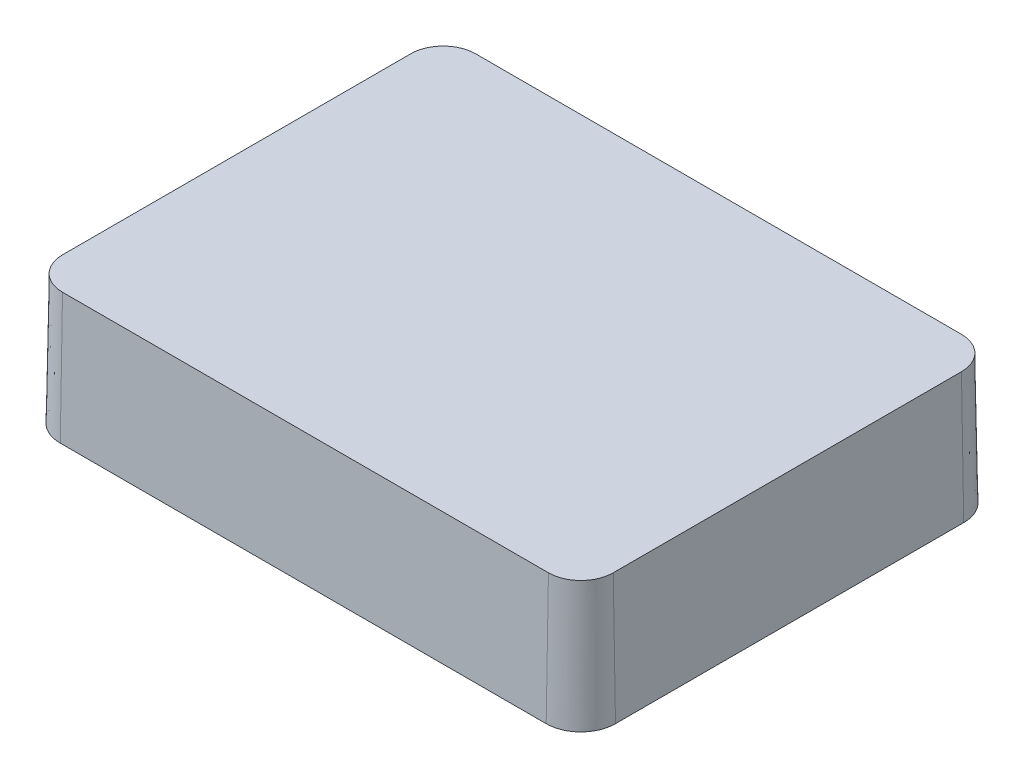
ISO-10303-21;
HEADER;
FILE_DESCRIPTION(('STEP AP214'),'2;1');
FILE_NAME('part.step','',(''),(''),'','','');
FILE_SCHEMA(('AUTOMOTIVE_DESIGN { 1 0 10303 214 1 1 1 1 }'));
ENDSEC;
DATA;
#1=APPLICATION_CONTEXT('core data for automotive mechanical design processes');
#2=APPLICATION_PROTOCOL_DEFINITION('international standard','automotive_design',2000,#1);
#3=PRODUCT_CONTEXT('',#1,'mechanical');
#4=PRODUCT('Part','Part','',(#3));
#5=PRODUCT_RELATED_PRODUCT_CATEGORY('part','',(#4));
#6=PRODUCT_DEFINITION_FORMATION('','',#4);
#7=PRODUCT_DEFINITION_CONTEXT('part definition',#1,'design');
#8=PRODUCT_DEFINITION('design','',#6,#7);
#9=PRODUCT_DEFINITION_SHAPE('','',#8);
#10=(LENGTH_UNIT() NAMED_UNIT(*) SI_UNIT(.MILLI.,.METRE.));
#11=(NAMED_UNIT(*) PLANE_ANGLE_UNIT() SI_UNIT($,.RADIAN.));
#12=(NAMED_UNIT(*) SI_UNIT($,.STERADIAN.) SOLID_ANGLE_UNIT());
#13=UNCERTAINTY_MEASURE_WITH_UNIT(LENGTH_MEASURE(1.E-05),#10,'distance_accuracy_value','');
#14=(GEOMETRIC_REPRESENTATION_CONTEXT(3) GLOBAL_UNCERTAINTY_ASSIGNED_CONTEXT((#13)) GLOBAL_UNIT_ASSIGNED_CONTEXT((#10,
#11,#12)) REPRESENTATION_CONTEXT('',''));
#15=CARTESIAN_POINT('',(0.,0.,0.));
#16=DIRECTION('',(0.,0.,1.));
#17=DIRECTION('',(1.,0.,0.));
#18=AXIS2_PLACEMENT_3D('',#15,#16,#17);
#19=CARTESIAN_POINT('',(-7.5,-0.5,-5.375));
#20=DIRECTION('',(0.,-1.,0.));
#21=DIRECTION('',(0.,0.,-1.));
#22=AXIS2_PLACEMENT_3D('',#19,#20,#21);
#23=PLANE('',#22);
#24=DIRECTION('',(0.,0.,1.));
#25=VECTOR('',#24,1.);
#26=CARTESIAN_POINT('',(-0.599999999999999,-0.5,2.93078797989721));
#27=LINE('',#26,#25);
#28=CARTESIAN_POINT('',(-0.599999999999999,-0.5,0.6));
#29=VERTEX_POINT('',#28);
#30=CARTESIAN_POINT('',(-0.599999999999999,-0.5,2.93078797989721));
#31=VERTEX_POINT('',#30);
#32=EDGE_CURVE('E602',#29,#31,#27,.T.);
#33=ORIENTED_EDGE('',*,*,#32,.F.);
#34=DIRECTION('',(1.,0.,0.));
#35=VECTOR('',#34,1.);
#36=CARTESIAN_POINT('',(-2.93078797989721,-0.5,0.6));
#37=LINE('',#36,#35);
#38=CARTESIAN_POINT('',(-2.93078797989721,-0.5,0.6));
#39=VERTEX_POINT('',#38);
#40=EDGE_CURVE('E328',#39,#29,#37,.T.);
#41=ORIENTED_EDGE('',*,*,#40,.F.);
#42=CARTESIAN_POINT('',(0.,-0.5,0.));
#43=DIRECTION('',(0.,-1.,0.));
#44=DIRECTION('',(0.,0.,-1.));
#45=AXIS2_PLACEMENT_3D('',#42,#43,#44);
#46=CIRCLE('',#45,2.99157453243438);
#47=EDGE_CURVE('E599',#31,#39,#46,.T.);
#48=ORIENTED_EDGE('',*,*,#47,.F.);
#49=EDGE_LOOP('',(#33,#41,#48));
#50=FACE_BOUND('',#49,.T.);
#51=CARTESIAN_POINT('',(-7.5,-0.5,-5.375));
#52=DIRECTION('',(0.,-1.,0.));
#53=DIRECTION('',(0.,0.,-1.));
#54=AXIS2_PLACEMENT_3D('',#51,#52,#53);
#55=CIRCLE('',#54,0.508651368442155);
#56=CARTESIAN_POINT('',(-7.5,-0.5,-5.88365136844215));
#57=VERTEX_POINT('',#56);
#58=CARTESIAN_POINT('',(-8.00865136844216,-0.5,-5.375));
#59=VERTEX_POINT('',#58);
#60=EDGE_CURVE('E565',#57,#59,#55,.F.);
#61=ORIENTED_EDGE('',*,*,#60,.F.);
#62=DIRECTION('',(-1.,0.,0.));
#63=VECTOR('',#62,1.);
#64=CARTESIAN_POINT('',(-7.5,-0.5,-5.88365136844215));
#65=LINE('',#64,#63);
#66=CARTESIAN_POINT('',(7.5,-0.5,-5.88365136844215));
#67=VERTEX_POINT('',#66);
#68=EDGE_CURVE('E560',#67,#57,#65,.T.);
#69=ORIENTED_EDGE('',*,*,#68,.F.);
#70=CARTESIAN_POINT('',(7.5,-0.5,-5.375));
#71=DIRECTION('',(0.,-1.,0.));
#72=DIRECTION('',(0.,0.,-1.));
#73=AXIS2_PLACEMENT_3D('',#70,#71,#72);
#74=CIRCLE('',#73,0.508651368442155);
#75=CARTESIAN_POINT('',(8.00865136844215,-0.5,-5.37499999999999));
#76=VERTEX_POINT('',#75);
#77=EDGE_CURVE('E586',#76,#67,#74,.F.);
#78=ORIENTED_EDGE('',*,*,#77,.F.);
#79=DIRECTION('',(0.,0.,-1.));
#80=VECTOR('',#79,1.);
#81=CARTESIAN_POINT('',(8.00865136844215,-0.5,5.37499999999999));
#82=LINE('',#81,#80);
#83=CARTESIAN_POINT('',(8.00865136844215,-0.5,5.375));
#84=VERTEX_POINT('',#83);
#85=EDGE_CURVE('E581',#84,#76,#82,.T.);
#86=ORIENTED_EDGE('',*,*,#85,.F.);
#87=CARTESIAN_POINT('',(7.5,-0.5,5.375));
#88=DIRECTION('',(0.,-1.,0.));
#89=DIRECTION('',(0.,0.,-1.));
#90=AXIS2_PLACEMENT_3D('',#87,#88,#89);
#91=CIRCLE('',#90,0.508651368442155);
#92=CARTESIAN_POINT('',(7.49999999999999,-0.5,5.88365136844215));
#93=VERTEX_POINT('',#92);
#94=EDGE_CURVE('E576',#93,#84,#91,.F.);
#95=ORIENTED_EDGE('',*,*,#94,.F.);
#96=DIRECTION('',(1.,0.,0.));
#97=VECTOR('',#96,1.);
#98=CARTESIAN_POINT('',(-7.5,-0.5,5.88365136844215));
#99=LINE('',#98,#97);
#100=CARTESIAN_POINT('',(-7.5,-0.5,5.88365136844215));
#101=VERTEX_POINT('',#100);
#102=EDGE_CURVE('E571',#101,#93,#99,.T.);
#103=ORIENTED_EDGE('',*,*,#102,.F.);
#104=CARTESIAN_POINT('',(-7.5,-0.5,5.375));
#105=DIRECTION('',(0.,-1.,0.));
#106=DIRECTION('',(0.,0.,-1.));
#107=AXIS2_PLACEMENT_3D('',#104,#105,#106);
#108=CIRCLE('',#107,0.508651368442155);
#109=CARTESIAN_POINT('',(-8.00865136844216,-0.5,5.37499999999999));
#110=VERTEX_POINT('',#109);
#111=EDGE_CURVE('E564',#110,#101,#108,.F.);
#112=ORIENTED_EDGE('',*,*,#111,.F.);
#113=DIRECTION('',(0.,0.,1.));
#114=VECTOR('',#113,1.);
#115=CARTESIAN_POINT('',(-8.00865136844216,-0.5,5.37499999999999));
#116=LINE('',#115,#114);
#117=EDGE_CURVE('E561',#59,#110,#116,.T.);
#118=ORIENTED_EDGE('',*,*,#117,.F.);
#119=EDGE_LOOP('',(#61,#69,#78,#86,#95,#103,#112,#118));
#120=FACE_BOUND('',#119,.T.);
#121=DIRECTION('',(0.,0.,1.));
#122=VECTOR('',#121,1.);
#123=CARTESIAN_POINT('',(-0.599999999999999,-0.5,-0.6));
#124=LINE('',#123,#122);
#125=CARTESIAN_POINT('',(-0.599999999999999,-0.5,-2.93078797989721));
#126=VERTEX_POINT('',#125);
#127=CARTESIAN_POINT('',(-0.599999999999999,-0.5,-0.6));
#128=VERTEX_POINT('',#127);
#129=EDGE_CURVE('E617',#126,#128,#124,.T.);
#130=ORIENTED_EDGE('',*,*,#129,.F.);
#131=CARTESIAN_POINT('',(0.,-0.5,0.));
#132=DIRECTION('',(0.,-1.,0.));
#133=DIRECTION('',(0.,0.,-1.));
#134=AXIS2_PLACEMENT_3D('',#131,#132,#133);
#135=CIRCLE('',#134,2.99157453243438);
#136=CARTESIAN_POINT('',(-2.93078797989721,-0.5,-0.6));
#137=VERTEX_POINT('',#136);
#138=EDGE_CURVE('E292',#137,#126,#135,.T.);
#139=ORIENTED_EDGE('',*,*,#138,.F.);
#140=DIRECTION('',(-1.,0.,0.));
#141=VECTOR('',#140,1.);
#142=CARTESIAN_POINT('',(-2.93078797989721,-0.5,-0.6));
#143=LINE('',#142,#141);
#144=EDGE_CURVE('E330',#128,#137,#143,.T.);
#145=ORIENTED_EDGE('',*,*,#144,.F.);
#146=EDGE_LOOP('',(#130,#139,#145));
#147=FACE_BOUND('',#146,.T.);
#148=DIRECTION('',(0.,0.,-1.));
#149=VECTOR('',#148,1.);
#150=CARTESIAN_POINT('',(0.599999999999999,-0.5,2.93078797989721));
#151=LINE('',#150,#149);
#152=CARTESIAN_POINT('',(0.599999999999999,-0.5,2.93078797989721));
#153=VERTEX_POINT('',#152);
#154=CARTESIAN_POINT('',(0.599999999999999,-0.5,0.6));
#155=VERTEX_POINT('',#154);
#156=EDGE_CURVE('E632',#153,#155,#151,.T.);
#157=ORIENTED_EDGE('',*,*,#156,.F.);
#158=CARTESIAN_POINT('',(0.,-0.5,0.));
#159=DIRECTION('',(0.,-1.,0.));
#160=DIRECTION('',(0.,0.,-1.));
#161=AXIS2_PLACEMENT_3D('',#158,#159,#160);
#162=CIRCLE('',#161,2.99157453243438);
#163=CARTESIAN_POINT('',(2.93078797989721,-0.5,0.6));
#164=VERTEX_POINT('',#163);
#165=EDGE_CURVE('E234',#164,#153,#162,.T.);
#166=ORIENTED_EDGE('',*,*,#165,.F.);
#167=DIRECTION('',(1.,0.,0.));
#168=VECTOR('',#167,1.);
#169=CARTESIAN_POINT('',(0.599999999999999,-0.5,0.6));
#170=LINE('',#169,#168);
#171=EDGE_CURVE('E293',#155,#164,#170,.T.);
#172=ORIENTED_EDGE('',*,*,#171,.F.);
#173=EDGE_LOOP('',(#157,#166,#172));
#174=FACE_BOUND('',#173,.T.);
#175=DIRECTION('',(-1.,0.,0.));
#176=VECTOR('',#175,1.);
#177=CARTESIAN_POINT('',(0.599999999999999,-0.5,-0.6));
#178=LINE('',#177,#176);
#179=CARTESIAN_POINT('',(2.93078797989721,-0.5,-0.6));
#180=VERTEX_POINT('',#179);
#181=CARTESIAN_POINT('',(0.599999999999999,-0.5,-0.6));
#182=VERTEX_POINT('',#181);
#183=EDGE_CURVE('E228',#180,#182,#178,.T.);
#184=ORIENTED_EDGE('',*,*,#183,.F.);
#185=CARTESIAN_POINT('',(0.,-0.5,0.));
#186=DIRECTION('',(0.,-1.,0.));
#187=DIRECTION('',(0.,0.,-1.));
#188=AXIS2_PLACEMENT_3D('',#185,#186,#187);
#189=CIRCLE('',#188,2.99157453243438);
#190=CARTESIAN_POINT('',(0.599999999999999,-0.5,-2.93078797989721));
#191=VERTEX_POINT('',#190);
#192=EDGE_CURVE('E238',#191,#180,#189,.T.);
#193=ORIENTED_EDGE('',*,*,#192,.F.);
#194=DIRECTION('',(0.,0.,-1.));
#195=VECTOR('',#194,1.);
#196=CARTESIAN_POINT('',(0.599999999999999,-0.5,-0.6));
#197=LINE('',#196,#195);
#198=EDGE_CURVE('E244',#182,#191,#197,.T.);
#199=ORIENTED_EDGE('',*,*,#198,.F.);
#200=EDGE_LOOP('',(#184,#193,#199));
#201=FACE_BOUND('',#200,.T.);
#202=ADVANCED_FACE('F38',(#50,#120,#147,#174,#201),#23,.T.);
#203=CARTESIAN_POINT('',(-7.5,-4.,-5.375));
#204=DIRECTION('',(0.,-1.,0.));
#205=DIRECTION('',(0.,0.,-1.));
#206=AXIS2_PLACEMENT_3D('',#203,#204,#205);
#207=PLANE('',#206);
#208=CARTESIAN_POINT('',(-7.5,-4.,-5.375));
#209=DIRECTION('',(0.,-1.,0.));
#210=DIRECTION('',(0.,0.,-1.));
#211=AXIS2_PLACEMENT_3D('',#208,#209,#210);
#212=CIRCLE('',#211,1.06982025971287);
#213=CARTESIAN_POINT('',(-7.5,-4.,-6.44482025971287));
#214=VERTEX_POINT('',#213);
#215=CARTESIAN_POINT('',(-8.56982025971287,-4.,-5.37499999999999));
#216=VERTEX_POINT('',#215);
#217=EDGE_CURVE('E479',#214,#216,#212,.F.);
#218=ORIENTED_EDGE('',*,*,#217,.F.);
#219=DIRECTION('',(-1.,0.,0.));
#220=VECTOR('',#219,1.);
#221=CARTESIAN_POINT('',(-7.5,-4.,-6.44482025971287));
#222=LINE('',#221,#220);
#223=CARTESIAN_POINT('',(7.49999999999999,-4.,-6.44482025971287));
#224=VERTEX_POINT('',#223);
#225=EDGE_CURVE('E483',#224,#214,#222,.T.);
#226=ORIENTED_EDGE('',*,*,#225,.F.);
#227=CARTESIAN_POINT('',(7.5,-4.,-5.375));
#228=DIRECTION('',(0.,-1.,0.));
#229=DIRECTION('',(0.,0.,-1.));
#230=AXIS2_PLACEMENT_3D('',#227,#228,#229);
#231=CIRCLE('',#230,1.06982025971287);
#232=CARTESIAN_POINT('',(8.56982025971287,-4.,-5.37499999999999));
#233=VERTEX_POINT('',#232);
#234=EDGE_CURVE('E487',#233,#224,#231,.F.);
#235=ORIENTED_EDGE('',*,*,#234,.F.);
#236=DIRECTION('',(0.,0.,-1.));
#237=VECTOR('',#236,1.);
#238=CARTESIAN_POINT('',(8.56982025971287,-4.,5.37499999999999));
#239=LINE('',#238,#237);
#240=CARTESIAN_POINT('',(8.56982025971287,-4.,5.37499999999999));
#241=VERTEX_POINT('',#240);
#242=EDGE_CURVE('E489',#241,#233,#239,.T.);
#243=ORIENTED_EDGE('',*,*,#242,.F.);
#244=CARTESIAN_POINT('',(7.5,-4.,5.375));
#245=DIRECTION('',(0.,-1.,0.));
#246=DIRECTION('',(0.,0.,-1.));
#247=AXIS2_PLACEMENT_3D('',#244,#245,#246);
#248=CIRCLE('',#247,1.06982025971287);
#249=CARTESIAN_POINT('',(7.49999999999999,-4.,6.44482025971287));
#250=VERTEX_POINT('',#249);
#251=EDGE_CURVE('E492',#250,#241,#248,.F.);
#252=ORIENTED_EDGE('',*,*,#251,.F.);
#253=DIRECTION('',(1.,0.,0.));
#254=VECTOR('',#253,1.);
#255=CARTESIAN_POINT('',(-7.5,-4.,6.44482025971287));
#256=LINE('',#255,#254);
#257=CARTESIAN_POINT('',(-7.49999999999999,-4.,6.44482025971287));
#258=VERTEX_POINT('',#257);
#259=EDGE_CURVE('E495',#258,#250,#256,.T.);
#260=ORIENTED_EDGE('',*,*,#259,.F.);
#261=CARTESIAN_POINT('',(-7.5,-4.,5.375));
#262=DIRECTION('',(0.,-1.,0.));
#263=DIRECTION('',(0.,0.,-1.));
#264=AXIS2_PLACEMENT_3D('',#261,#262,#263);
#265=CIRCLE('',#264,1.06982025971287);
#266=CARTESIAN_POINT('',(-8.56982025971287,-4.,5.37499999999999));
#267=VERTEX_POINT('',#266);
#268=EDGE_CURVE('E498',#267,#258,#265,.F.);
#269=ORIENTED_EDGE('',*,*,#268,.F.);
#270=DIRECTION('',(0.,0.,1.));
#271=VECTOR('',#270,1.);
#272=CARTESIAN_POINT('',(-8.56982025971287,-4.,5.37499999999999));
#273=LINE('',#272,#271);
#274=EDGE_CURVE('E482',#216,#267,#273,.T.);
#275=ORIENTED_EDGE('',*,*,#274,.F.);
#276=EDGE_LOOP('',(#218,#226,#235,#243,#252,#260,#269,#275));
#277=FACE_BOUND('',#276,.T.);
#278=DIRECTION('',(-1.,0.,0.));
#279=VECTOR('',#278,1.);
#280=CARTESIAN_POINT('',(-7.5,-4.,-5.94474409569092));
#281=LINE('',#280,#279);
#282=CARTESIAN_POINT('',(7.49999999999999,-4.,-5.94474409569092));
#283=VERTEX_POINT('',#282);
#284=CARTESIAN_POINT('',(-7.5,-4.,-5.94474409569092));
#285=VERTEX_POINT('',#284);
#286=EDGE_CURVE('E554',#283,#285,#281,.T.);
#287=ORIENTED_EDGE('',*,*,#286,.T.);
#288=CARTESIAN_POINT('',(-7.5,-4.,-5.375));
#289=DIRECTION('',(0.,-1.,0.));
#290=DIRECTION('',(0.,0.,-1.));
#291=AXIS2_PLACEMENT_3D('',#288,#289,#290);
#292=CIRCLE('',#291,0.569744095690917);
#293=CARTESIAN_POINT('',(-8.06974409569092,-4.,-5.375));
#294=VERTEX_POINT('',#293);
#295=EDGE_CURVE('E539',#285,#294,#292,.F.);
#296=ORIENTED_EDGE('',*,*,#295,.T.);
#297=DIRECTION('',(0.,0.,1.));
#298=VECTOR('',#297,1.);
#299=CARTESIAN_POINT('',(-8.06974409569092,-4.,5.37499999999999));
#300=LINE('',#299,#298);
#301=CARTESIAN_POINT('',(-8.06974409569092,-4.,5.37499999999999));
#302=VERTEX_POINT('',#301);
#303=EDGE_CURVE('E534',#294,#302,#300,.T.);
#304=ORIENTED_EDGE('',*,*,#303,.T.);
#305=CARTESIAN_POINT('',(-7.5,-4.,5.375));
#306=DIRECTION('',(0.,-1.,0.));
#307=DIRECTION('',(0.,0.,-1.));
#308=AXIS2_PLACEMENT_3D('',#305,#306,#307);
#309=CIRCLE('',#308,0.569744095690917);
#310=CARTESIAN_POINT('',(-7.5,-4.,5.94474409569092));
#311=VERTEX_POINT('',#310);
#312=EDGE_CURVE('E538',#302,#311,#309,.F.);
#313=ORIENTED_EDGE('',*,*,#312,.T.);
#314=DIRECTION('',(1.,0.,0.));
#315=VECTOR('',#314,1.);
#316=CARTESIAN_POINT('',(-7.5,-4.,5.94474409569092));
#317=LINE('',#316,#315);
#318=CARTESIAN_POINT('',(7.49999999999999,-4.,5.94474409569092));
#319=VERTEX_POINT('',#318);
#320=EDGE_CURVE('E542',#311,#319,#317,.T.);
#321=ORIENTED_EDGE('',*,*,#320,.T.);
#322=CARTESIAN_POINT('',(7.5,-4.,5.375));
#323=DIRECTION('',(0.,-1.,0.));
#324=DIRECTION('',(0.,0.,-1.));
#325=AXIS2_PLACEMENT_3D('',#322,#323,#324);
#326=CIRCLE('',#325,0.569744095690917);
#327=CARTESIAN_POINT('',(8.06974409569091,-4.,5.375));
#328=VERTEX_POINT('',#327);
#329=EDGE_CURVE('E545',#319,#328,#326,.F.);
#330=ORIENTED_EDGE('',*,*,#329,.T.);
#331=DIRECTION('',(0.,0.,-1.));
#332=VECTOR('',#331,1.);
#333=CARTESIAN_POINT('',(8.06974409569091,-4.,5.37499999999999));
#334=LINE('',#333,#332);
#335=CARTESIAN_POINT('',(8.06974409569091,-4.,-5.37499999999999));
#336=VERTEX_POINT('',#335);
#337=EDGE_CURVE('E548',#328,#336,#334,.T.);
#338=ORIENTED_EDGE('',*,*,#337,.T.);
#339=CARTESIAN_POINT('',(7.5,-4.,-5.375));
#340=DIRECTION('',(0.,-1.,0.));
#341=DIRECTION('',(0.,0.,-1.));
#342=AXIS2_PLACEMENT_3D('',#339,#340,#341);
#343=CIRCLE('',#342,0.569744095690917);
#344=EDGE_CURVE('E551',#336,#283,#343,.F.);
#345=ORIENTED_EDGE('',*,*,#344,.T.);
#346=EDGE_LOOP('',(#287,#296,#304,#313,#321,#330,#338,#345));
#347=FACE_BOUND('',#346,.T.);
#348=ADVANCED_FACE('F417',(#277,#347),#207,.T.);
#349=CARTESIAN_POINT('',(-7.5,0.,-5.375));
#350=DIRECTION('',(0.,-1.,0.));
#351=DIRECTION('',(0.,0.,-1.));
#352=AXIS2_PLACEMENT_3D('',#349,#350,#351);
#353=CONICAL_SURFACE('',#352,1.,0.0174532925199433);
#354=CARTESIAN_POINT('',(-7.5,0.,-5.375));
#355=DIRECTION('',(0.,1.,0.));
#356=DIRECTION('',(0.,0.,-1.));
#357=AXIS2_PLACEMENT_3D('',#354,#355,#356);
#358=CIRCLE('',#357,1.);
#359=CARTESIAN_POINT('',(-7.5,0.,-6.375));
#360=VERTEX_POINT('',#359);
#361=CARTESIAN_POINT('',(-8.5,0.,-5.37499999999999));
#362=VERTEX_POINT('',#361);
#363=EDGE_CURVE('E527',#360,#362,#358,.T.);
#364=ORIENTED_EDGE('',*,*,#363,.F.);
#365=DIRECTION('',(0.,-0.999847695156391,-0.0174524064372835));
#366=VECTOR('',#365,1.);
#367=CARTESIAN_POINT('',(-7.5,0.,-6.375));
#368=LINE('',#367,#366);
#369=EDGE_CURVE('E11',#214,#360,#368,.F.);
#370=ORIENTED_EDGE('',*,*,#369,.F.);
#371=ORIENTED_EDGE('',*,*,#217,.T.);
#372=DIRECTION('',(-0.0174524064372835,-0.999847695156391,0.));
#373=VECTOR('',#372,1.);
#374=CARTESIAN_POINT('',(-8.5,0.,-5.37499999999999));
#375=LINE('',#374,#373);
#376=EDGE_CURVE('E486',#216,#362,#375,.F.);
#377=ORIENTED_EDGE('',*,*,#376,.T.);
#378=EDGE_LOOP('',(#364,#370,#371,#377));
#379=FACE_BOUND('',#378,.T.);
#380=ADVANCED_FACE('F421',(#379),#353,.T.);
#381=CARTESIAN_POINT('',(-7.5,0.,-6.375));
#382=DIRECTION('',(0.,0.0174524064372835,-0.999847695156391));
#383=DIRECTION('',(0.,0.999847695156391,0.0174524064372835));
#384=AXIS2_PLACEMENT_3D('',#381,#382,#383);
#385=PLANE('',#384);
#386=DIRECTION('',(-1.,0.,0.));
#387=VECTOR('',#386,1.);
#388=CARTESIAN_POINT('',(-7.5,0.,-6.375));
#389=LINE('',#388,#387);
#390=CARTESIAN_POINT('',(7.49999999999999,0.,-6.375));
#391=VERTEX_POINT('',#390);
#392=EDGE_CURVE('E464',#391,#360,#389,.T.);
#393=ORIENTED_EDGE('',*,*,#392,.F.);
#394=DIRECTION('',(0.,-0.999847695156391,-0.0174524064372835));
#395=VECTOR('',#394,1.);
#396=CARTESIAN_POINT('',(7.49999999999999,0.,-6.375));
#397=LINE('',#396,#395);
#398=EDGE_CURVE('E42',#224,#391,#397,.F.);
#399=ORIENTED_EDGE('',*,*,#398,.F.);
#400=ORIENTED_EDGE('',*,*,#225,.T.);
#401=ORIENTED_EDGE('',*,*,#369,.T.);
#402=EDGE_LOOP('',(#393,#399,#400,#401));
#403=FACE_BOUND('',#402,.T.);
#404=ADVANCED_FACE('F40',(#403),#385,.T.);
#405=CARTESIAN_POINT('',(7.5,0.,-5.375));
#406=DIRECTION('',(0.,-1.,0.));
#407=DIRECTION('',(0.,0.,1.));
#408=AXIS2_PLACEMENT_3D('',#405,#406,#407);
#409=CONICAL_SURFACE('',#408,1.,0.0174532925199433);
#410=CARTESIAN_POINT('',(7.5,0.,-5.375));
#411=DIRECTION('',(0.,1.,0.));
#412=DIRECTION('',(0.,0.,1.));
#413=AXIS2_PLACEMENT_3D('',#410,#411,#412);
#414=CIRCLE('',#413,1.);
#415=CARTESIAN_POINT('',(8.5,0.,-5.37499999999999));
#416=VERTEX_POINT('',#415);
#417=EDGE_CURVE('E457',#416,#391,#414,.T.);
#418=ORIENTED_EDGE('',*,*,#417,.F.);
#419=DIRECTION('',(0.0174524064372835,-0.999847695156391,0.));
#420=VECTOR('',#419,1.);
#421=CARTESIAN_POINT('',(8.5,0.,-5.37499999999999));
#422=LINE('',#421,#420);
#423=EDGE_CURVE('E460',#233,#416,#422,.F.);
#424=ORIENTED_EDGE('',*,*,#423,.F.);
#425=ORIENTED_EDGE('',*,*,#234,.T.);
#426=ORIENTED_EDGE('',*,*,#398,.T.);
#427=EDGE_LOOP('',(#418,#424,#425,#426));
#428=FACE_BOUND('',#427,.T.);
#429=ADVANCED_FACE('F447',(#428),#409,.T.);
#430=CARTESIAN_POINT('',(8.5,0.,5.37499999999999));
#431=DIRECTION('',(0.999847695156391,0.0174524064372835,0.));
#432=DIRECTION('',(-0.0174524064372835,0.999847695156391,0.));
#433=AXIS2_PLACEMENT_3D('',#430,#431,#432);
#434=PLANE('',#433);
#435=DIRECTION('',(0.,0.,-1.));
#436=VECTOR('',#435,1.);
#437=CARTESIAN_POINT('',(8.5,0.,5.37499999999999));
#438=LINE('',#437,#436);
#439=CARTESIAN_POINT('',(8.5,0.,5.37499999999999));
#440=VERTEX_POINT('',#439);
#441=EDGE_CURVE('E465',#440,#416,#438,.T.);
#442=ORIENTED_EDGE('',*,*,#441,.F.);
#443=DIRECTION('',(0.0174524064372835,-0.999847695156391,0.));
#444=VECTOR('',#443,1.);
#445=CARTESIAN_POINT('',(8.5,0.,5.37499999999999));
#446=LINE('',#445,#444);
#447=EDGE_CURVE('E510',#241,#440,#446,.F.);
#448=ORIENTED_EDGE('',*,*,#447,.F.);
#449=ORIENTED_EDGE('',*,*,#242,.T.);
#450=ORIENTED_EDGE('',*,*,#423,.T.);
#451=EDGE_LOOP('',(#442,#448,#449,#450));
#452=FACE_BOUND('',#451,.T.);
#453=ADVANCED_FACE('F444',(#452),#434,.T.);
#454=CARTESIAN_POINT('',(7.5,0.,5.375));
#455=DIRECTION('',(0.,-1.,0.));
#456=DIRECTION('',(0.,0.,-1.));
#457=AXIS2_PLACEMENT_3D('',#454,#455,#456);
#458=CONICAL_SURFACE('',#457,1.,0.0174532925199433);
#459=CARTESIAN_POINT('',(7.5,0.,5.375));
#460=DIRECTION('',(0.,1.,0.));
#461=DIRECTION('',(0.,0.,-1.));
#462=AXIS2_PLACEMENT_3D('',#459,#460,#461);
#463=CIRCLE('',#462,1.);
#464=CARTESIAN_POINT('',(7.49999999999999,0.,6.375));
#465=VERTEX_POINT('',#464);
#466=EDGE_CURVE('E472',#465,#440,#463,.T.);
#467=ORIENTED_EDGE('',*,*,#466,.F.);
#468=DIRECTION('',(0.,-0.999847695156391,0.0174524064372835));
#469=VECTOR('',#468,1.);
#470=CARTESIAN_POINT('',(7.49999999999999,0.,6.375));
#471=LINE('',#470,#469);
#472=EDGE_CURVE('E508',#250,#465,#471,.F.);
#473=ORIENTED_EDGE('',*,*,#472,.F.);
#474=ORIENTED_EDGE('',*,*,#251,.T.);
#475=ORIENTED_EDGE('',*,*,#447,.T.);
#476=EDGE_LOOP('',(#467,#473,#474,#475));
#477=FACE_BOUND('',#476,.T.);
#478=ADVANCED_FACE('F440',(#477),#458,.T.);
#479=CARTESIAN_POINT('',(-7.5,0.,6.375));
#480=DIRECTION('',(0.,0.0174524064372835,0.999847695156391));
#481=DIRECTION('',(0.,-0.999847695156391,0.0174524064372835));
#482=AXIS2_PLACEMENT_3D('',#479,#480,#481);
#483=PLANE('',#482);
#484=DIRECTION('',(1.,0.,0.));
#485=VECTOR('',#484,1.);
#486=CARTESIAN_POINT('',(-7.5,0.,6.375));
#487=LINE('',#486,#485);
#488=CARTESIAN_POINT('',(-7.5,0.,6.375));
#489=VERTEX_POINT('',#488);
#490=EDGE_CURVE('E474',#489,#465,#487,.T.);
#491=ORIENTED_EDGE('',*,*,#490,.F.);
#492=DIRECTION('',(0.,-0.999847695156391,0.0174524064372835));
#493=VECTOR('',#492,1.);
#494=CARTESIAN_POINT('',(-7.5,0.,6.375));
#495=LINE('',#494,#493);
#496=EDGE_CURVE('E506',#258,#489,#495,.F.);
#497=ORIENTED_EDGE('',*,*,#496,.F.);
#498=ORIENTED_EDGE('',*,*,#259,.T.);
#499=ORIENTED_EDGE('',*,*,#472,.T.);
#500=EDGE_LOOP('',(#491,#497,#498,#499));
#501=FACE_BOUND('',#500,.T.);
#502=ADVANCED_FACE('F436',(#501),#483,.T.);
#503=CARTESIAN_POINT('',(-7.5,0.,5.375));
#504=DIRECTION('',(0.,-1.,0.));
#505=DIRECTION('',(0.,0.,-1.));
#506=AXIS2_PLACEMENT_3D('',#503,#504,#505);
#507=CONICAL_SURFACE('',#506,1.,0.0174532925199433);
#508=CARTESIAN_POINT('',(-7.5,0.,5.375));
#509=DIRECTION('',(0.,1.,0.));
#510=DIRECTION('',(0.,0.,-1.));
#511=AXIS2_PLACEMENT_3D('',#508,#509,#510);
#512=CIRCLE('',#511,1.);
#513=CARTESIAN_POINT('',(-8.5,0.,5.37499999999999));
#514=VERTEX_POINT('',#513);
#515=EDGE_CURVE('E522',#514,#489,#512,.T.);
#516=ORIENTED_EDGE('',*,*,#515,.F.);
#517=DIRECTION('',(-0.0174524064372835,-0.999847695156391,0.));
#518=VECTOR('',#517,1.);
#519=CARTESIAN_POINT('',(-8.5,0.,5.37499999999999));
#520=LINE('',#519,#518);
#521=EDGE_CURVE('E504',#267,#514,#520,.F.);
#522=ORIENTED_EDGE('',*,*,#521,.F.);
#523=ORIENTED_EDGE('',*,*,#268,.T.);
#524=ORIENTED_EDGE('',*,*,#496,.T.);
#525=EDGE_LOOP('',(#516,#522,#523,#524));
#526=FACE_BOUND('',#525,.T.);
#527=ADVANCED_FACE('F432',(#526),#507,.T.);
#528=CARTESIAN_POINT('',(-8.5,0.,5.37499999999999));
#529=DIRECTION('',(-0.999847695156391,0.0174524064372835,0.));
#530=DIRECTION('',(-0.0174524064372835,-0.999847695156391,0.));
#531=AXIS2_PLACEMENT_3D('',#528,#529,#530);
#532=PLANE('',#531);
#533=DIRECTION('',(0.,0.,1.));
#534=VECTOR('',#533,1.);
#535=CARTESIAN_POINT('',(-8.5,0.,5.37499999999999));
#536=LINE('',#535,#534);
#537=EDGE_CURVE('E525',#362,#514,#536,.T.);
#538=ORIENTED_EDGE('',*,*,#537,.F.);
#539=ORIENTED_EDGE('',*,*,#376,.F.);
#540=ORIENTED_EDGE('',*,*,#274,.T.);
#541=ORIENTED_EDGE('',*,*,#521,.T.);
#542=EDGE_LOOP('',(#538,#539,#540,#541));
#543=FACE_BOUND('',#542,.T.);
#544=ADVANCED_FACE('F425',(#543),#532,.T.);
#545=CARTESIAN_POINT('',(-7.5,0.,-5.375));
#546=DIRECTION('',(0.,-1.,0.));
#547=DIRECTION('',(0.,0.,-1.));
#548=AXIS2_PLACEMENT_3D('',#545,#546,#547);
#549=PLANE('',#548);
#550=ORIENTED_EDGE('',*,*,#363,.T.);
#551=ORIENTED_EDGE('',*,*,#537,.T.);
#552=ORIENTED_EDGE('',*,*,#515,.T.);
#553=ORIENTED_EDGE('',*,*,#490,.T.);
#554=ORIENTED_EDGE('',*,*,#466,.T.);
#555=ORIENTED_EDGE('',*,*,#441,.T.);
#556=ORIENTED_EDGE('',*,*,#417,.T.);
#557=ORIENTED_EDGE('',*,*,#392,.T.);
#558=EDGE_LOOP('',(#550,#551,#552,#553,#554,#555,#556,#557));
#559=FACE_BOUND('',#558,.T.);
#560=ADVANCED_FACE('F387',(#559),#549,.F.);
#561=CARTESIAN_POINT('',(-7.5,-0.00872620321864177,-5.375));
#562=DIRECTION('',(0.,-1.,0.));
#563=DIRECTION('',(0.,0.,-1.));
#564=AXIS2_PLACEMENT_3D('',#561,#562,#563);
#565=CONICAL_SURFACE('',#564,0.500076152421804,0.0174532925199433);
#566=ORIENTED_EDGE('',*,*,#60,.T.);
#567=DIRECTION('',(-0.0174524064372835,-0.999847695156391,0.));
#568=VECTOR('',#567,1.);
#569=CARTESIAN_POINT('',(-8.00007615242181,-0.00872620321864177,-5.375));
#570=LINE('',#569,#568);
#571=EDGE_CURVE('E557',#294,#59,#570,.F.);
#572=ORIENTED_EDGE('',*,*,#571,.F.);
#573=ORIENTED_EDGE('',*,*,#295,.F.);
#574=DIRECTION('',(0.,0.999847695156391,0.0174524064372835));
#575=VECTOR('',#574,1.);
#576=CARTESIAN_POINT('',(-7.5,-0.00872620321864177,-5.8750761524218));
#577=LINE('',#576,#575);
#578=EDGE_CURVE('E528',#285,#57,#577,.T.);
#579=ORIENTED_EDGE('',*,*,#578,.T.);
#580=EDGE_LOOP('',(#566,#572,#573,#579));
#581=FACE_BOUND('',#580,.T.);
#582=ADVANCED_FACE('F383',(#581),#565,.F.);
#583=CARTESIAN_POINT('',(-7.5,-0.00872620321864177,-5.8750761524218));
#584=DIRECTION('',(0.,0.0174524064372835,-0.999847695156391));
#585=DIRECTION('',(0.,0.999847695156391,0.0174524064372835));
#586=AXIS2_PLACEMENT_3D('',#583,#584,#585);
#587=PLANE('',#586);
#588=ORIENTED_EDGE('',*,*,#68,.T.);
#589=ORIENTED_EDGE('',*,*,#578,.F.);
#590=ORIENTED_EDGE('',*,*,#286,.F.);
#591=DIRECTION('',(0.,-0.999847695156391,-0.0174524064372835));
#592=VECTOR('',#591,1.);
#593=CARTESIAN_POINT('',(7.5,-0.00872620321864177,-5.8750761524218));
#594=LINE('',#593,#592);
#595=EDGE_CURVE('E531',#283,#67,#594,.F.);
#596=ORIENTED_EDGE('',*,*,#595,.T.);
#597=EDGE_LOOP('',(#588,#589,#590,#596));
#598=FACE_BOUND('',#597,.T.);
#599=ADVANCED_FACE('F386',(#598),#587,.F.);
#600=CARTESIAN_POINT('',(7.5,-0.00872620321864177,-5.375));
#601=DIRECTION('',(0.,-1.,0.));
#602=DIRECTION('',(0.,0.,1.));
#603=AXIS2_PLACEMENT_3D('',#600,#601,#602);
#604=CONICAL_SURFACE('',#603,0.500076152421804,0.0174532925199433);
#605=ORIENTED_EDGE('',*,*,#77,.T.);
#606=ORIENTED_EDGE('',*,*,#595,.F.);
#607=ORIENTED_EDGE('',*,*,#344,.F.);
#608=DIRECTION('',(-0.0174524064372835,0.999847695156391,0.));
#609=VECTOR('',#608,1.);
#610=CARTESIAN_POINT('',(8.0000761524218,-0.00872620321864177,-5.37499999999999));
#611=LINE('',#610,#609);
#612=EDGE_CURVE('E583',#336,#76,#611,.T.);
#613=ORIENTED_EDGE('',*,*,#612,.T.);
#614=EDGE_LOOP('',(#605,#606,#607,#613));
#615=FACE_BOUND('',#614,.T.);
#616=ADVANCED_FACE('F391',(#615),#604,.F.);
#617=CARTESIAN_POINT('',(8.0000761524218,-0.00872620321864177,5.37499999999999));
#618=DIRECTION('',(0.999847695156391,0.0174524064372835,0.));
#619=DIRECTION('',(-0.0174524064372835,0.999847695156391,0.));
#620=AXIS2_PLACEMENT_3D('',#617,#618,#619);
#621=PLANE('',#620);
#622=ORIENTED_EDGE('',*,*,#85,.T.);
#623=ORIENTED_EDGE('',*,*,#612,.F.);
#624=ORIENTED_EDGE('',*,*,#337,.F.);
#625=DIRECTION('',(0.0174524064372835,-0.999847695156391,0.));
#626=VECTOR('',#625,1.);
#627=CARTESIAN_POINT('',(8.0000761524218,-0.00872620321864177,5.375));
#628=LINE('',#627,#626);
#629=EDGE_CURVE('E578',#328,#84,#628,.F.);
#630=ORIENTED_EDGE('',*,*,#629,.T.);
#631=EDGE_LOOP('',(#622,#623,#624,#630));
#632=FACE_BOUND('',#631,.T.);
#633=ADVANCED_FACE('F395',(#632),#621,.F.);
#634=CARTESIAN_POINT('',(7.5,-0.00872620321864177,5.375));
#635=DIRECTION('',(0.,-1.,0.));
#636=DIRECTION('',(0.,0.,-1.));
#637=AXIS2_PLACEMENT_3D('',#634,#635,#636);
#638=CONICAL_SURFACE('',#637,0.500076152421804,0.0174532925199433);
#639=ORIENTED_EDGE('',*,*,#94,.T.);
#640=ORIENTED_EDGE('',*,*,#629,.F.);
#641=ORIENTED_EDGE('',*,*,#329,.F.);
#642=DIRECTION('',(0.,-0.999847695156391,0.0174524064372835));
#643=VECTOR('',#642,1.);
#644=CARTESIAN_POINT('',(7.49999999999999,-0.00872620321864177,5.8750761524218));
#645=LINE('',#644,#643);
#646=EDGE_CURVE('E573',#319,#93,#645,.F.);
#647=ORIENTED_EDGE('',*,*,#646,.T.);
#648=EDGE_LOOP('',(#639,#640,#641,#647));
#649=FACE_BOUND('',#648,.T.);
#650=ADVANCED_FACE('F399',(#649),#638,.F.);
#651=CARTESIAN_POINT('',(-7.5,-0.00872620321864177,5.8750761524218));
#652=DIRECTION('',(0.,0.0174524064372835,0.999847695156391));
#653=DIRECTION('',(0.,-0.999847695156391,0.0174524064372835));
#654=AXIS2_PLACEMENT_3D('',#651,#652,#653);
#655=PLANE('',#654);
#656=ORIENTED_EDGE('',*,*,#102,.T.);
#657=ORIENTED_EDGE('',*,*,#646,.F.);
#658=ORIENTED_EDGE('',*,*,#320,.F.);
#659=DIRECTION('',(0.,-0.999847695156391,0.0174524064372835));
#660=VECTOR('',#659,1.);
#661=CARTESIAN_POINT('',(-7.5,-0.00872620321864177,5.8750761524218));
#662=LINE('',#661,#660);
#663=EDGE_CURVE('E568',#311,#101,#662,.F.);
#664=ORIENTED_EDGE('',*,*,#663,.T.);
#665=EDGE_LOOP('',(#656,#657,#658,#664));
#666=FACE_BOUND('',#665,.T.);
#667=ADVANCED_FACE('F403',(#666),#655,.F.);
#668=CARTESIAN_POINT('',(-7.5,-0.00872620321864177,5.375));
#669=DIRECTION('',(0.,-1.,0.));
#670=DIRECTION('',(0.,0.,-1.));
#671=AXIS2_PLACEMENT_3D('',#668,#669,#670);
#672=CONICAL_SURFACE('',#671,0.500076152421804,0.0174532925199433);
#673=ORIENTED_EDGE('',*,*,#111,.T.);
#674=ORIENTED_EDGE('',*,*,#663,.F.);
#675=ORIENTED_EDGE('',*,*,#312,.F.);
#676=DIRECTION('',(-0.0174524064372835,-0.999847695156391,0.));
#677=VECTOR('',#676,1.);
#678=CARTESIAN_POINT('',(-8.00007615242181,-0.00872620321864177,5.37499999999999));
#679=LINE('',#678,#677);
#680=EDGE_CURVE('E566',#302,#110,#679,.F.);
#681=ORIENTED_EDGE('',*,*,#680,.T.);
#682=EDGE_LOOP('',(#673,#674,#675,#681));
#683=FACE_BOUND('',#682,.T.);
#684=ADVANCED_FACE('F407',(#683),#672,.F.);
#685=CARTESIAN_POINT('',(-8.00007615242181,-0.00872620321864177,5.37499999999999));
#686=DIRECTION('',(-0.999847695156391,0.0174524064372835,0.));
#687=DIRECTION('',(-0.0174524064372835,-0.999847695156391,0.));
#688=AXIS2_PLACEMENT_3D('',#685,#686,#687);
#689=PLANE('',#688);
#690=ORIENTED_EDGE('',*,*,#117,.T.);
#691=ORIENTED_EDGE('',*,*,#680,.F.);
#692=ORIENTED_EDGE('',*,*,#303,.F.);
#693=ORIENTED_EDGE('',*,*,#571,.T.);
#694=EDGE_LOOP('',(#690,#691,#692,#693));
#695=FACE_BOUND('',#694,.T.);
#696=ADVANCED_FACE('F355',(#695),#689,.F.);
#697=CARTESIAN_POINT('',(-2.93078797989721,-0.5,0.6));
#698=DIRECTION('',(0.,-0.0261769483078732,-0.999657324975557));
#699=DIRECTION('',(0.,0.999657324975557,-0.0261769483078732));
#700=AXIS2_PLACEMENT_3D('',#697,#698,#699);
#701=PLANE('',#700);
#702=ORIENTED_EDGE('',*,*,#40,.T.);
#703=DIRECTION('',(0.0261679842649794,0.99931500198837,-0.0261679842649794));
#704=VECTOR('',#703,1.);
#705=CARTESIAN_POINT('',(-0.60159603830294,-0.560950243768348,0.601596038302941));
#706=LINE('',#705,#704);
#707=CARTESIAN_POINT('',(-0.744022568630528,-6.,0.744022568630528));
#708=VERTEX_POINT('',#707);
#709=EDGE_CURVE('E370',#708,#29,#706,.T.);
#710=ORIENTED_EDGE('',*,*,#709,.F.);
#711=DIRECTION('',(-1.,0.,0.));
#712=VECTOR('',#711,1.);
#713=CARTESIAN_POINT('',(-2.93078797989721,-6.,0.744022568630528));
#714=LINE('',#713,#712);
#715=CARTESIAN_POINT('',(-2.74863286088405,-6.,0.744022568630528));
#716=VERTEX_POINT('',#715);
#717=EDGE_CURVE('E377',#716,#708,#714,.F.);
#718=ORIENTED_EDGE('',*,*,#717,.F.);
#719=CARTESIAN_POINT('',(-2.74863286088405,-6.,0.744022568630528));
#720=CARTESIAN_POINT('',(-2.77996443714949,-5.08336550958536,0.720019649756919));
#721=CARTESIAN_POINT('',(-2.81080981863525,-4.16671492786495,0.696016309517639));
#722=CARTESIAN_POINT('',(-2.87152819162615,-2.33338159453117,0.648008786640784));
#723=CARTESIAN_POINT('',(-2.90140118314478,-1.41669884291825,0.624004604003222));
#724=CARTESIAN_POINT('',(-2.93078797989721,-0.500000000000001,0.6));
#725=B_SPLINE_CURVE_WITH_KNOTS('',3,(#719,#720,#721,#722,#723,#724),.UNSPECIFIED.,.F.,.F.,(4,2,
4),(0.,2.75245035955785,5.50490068092589),.UNSPECIFIED.);
#726=EDGE_CURVE('E360',#716,#39,#725,.T.);
#727=ORIENTED_EDGE('',*,*,#726,.T.);
#728=EDGE_LOOP('',(#702,#710,#718,#727));
#729=FACE_BOUND('',#728,.T.);
#730=ADVANCED_FACE('F350',(#729),#701,.T.);
#731=CARTESIAN_POINT('',(-0.599999999999999,-0.5,2.93078797989721));
#732=DIRECTION('',(0.999657324975557,-0.0261769483078732,0.));
#733=DIRECTION('',(0.0261769483078732,0.999657324975557,0.));
#734=AXIS2_PLACEMENT_3D('',#731,#732,#733);
#735=PLANE('',#734);
#736=ORIENTED_EDGE('',*,*,#32,.T.);
#737=CARTESIAN_POINT('',(-0.744022568630528,-6.,2.74863286088405));
#738=CARTESIAN_POINT('',(-0.720019649756918,-5.08336550958536,2.7799644371495));
#739=CARTESIAN_POINT('',(-0.696016309517638,-4.16671492786495,2.81080981863525));
#740=CARTESIAN_POINT('',(-0.648008786640783,-2.33338159453117,2.87152819162615));
#741=CARTESIAN_POINT('',(-0.624004604003221,-1.41669884291825,2.90140118314478));
#742=CARTESIAN_POINT('',(-0.599999999999999,-0.500000000000001,2.93078797989721));
#743=B_SPLINE_CURVE_WITH_KNOTS('',3,(#737,#738,#739,#740,#741,#742),.UNSPECIFIED.,.F.,.F.,(4,2,
4),(0.,2.75245035955785,5.50490068092589),.UNSPECIFIED.);
#744=CARTESIAN_POINT('',(-0.744022568630528,-6.,2.74863286088405));
#745=VERTEX_POINT('',#744);
#746=EDGE_CURVE('E368',#745,#31,#743,.T.);
#747=ORIENTED_EDGE('',*,*,#746,.F.);
#748=DIRECTION('',(0.,0.,-1.));
#749=VECTOR('',#748,1.);
#750=CARTESIAN_POINT('',(-0.744022568630528,-6.,2.93078797989721));
#751=LINE('',#750,#749);
#752=EDGE_CURVE('E596',#708,#745,#751,.F.);
#753=ORIENTED_EDGE('',*,*,#752,.F.);
#754=ORIENTED_EDGE('',*,*,#709,.T.);
#755=EDGE_LOOP('',(#736,#747,#753,#754));
#756=FACE_BOUND('',#755,.T.);
#757=ADVANCED_FACE('F354',(#756),#735,.T.);
#758=CARTESIAN_POINT('',(0.,-0.5,0.));
#759=DIRECTION('',(0.,1.,0.));
#760=DIRECTION('',(0.,0.,-1.));
#761=AXIS2_PLACEMENT_3D('',#758,#759,#760);
#762=CONICAL_SURFACE('',#761,2.99157453243438,0.026179938779915);
#763=ORIENTED_EDGE('',*,*,#47,.T.);
#764=ORIENTED_EDGE('',*,*,#726,.F.);
#765=CARTESIAN_POINT('',(0.,-6.,0.));
#766=DIRECTION('',(0.,-1.,0.));
#767=DIRECTION('',(0.,0.,-1.));
#768=AXIS2_PLACEMENT_3D('',#765,#766,#767);
#769=CIRCLE('',#768,2.84755196380385);
#770=EDGE_CURVE('E369',#745,#716,#769,.T.);
#771=ORIENTED_EDGE('',*,*,#770,.F.);
#772=ORIENTED_EDGE('',*,*,#746,.T.);
#773=EDGE_LOOP('',(#763,#764,#771,#772));
#774=FACE_BOUND('',#773,.T.);
#775=ADVANCED_FACE('F348',(#774),#762,.T.);
#776=CARTESIAN_POINT('',(0.,-6.,0.));
#777=DIRECTION('',(0.,-1.,0.));
#778=DIRECTION('',(0.,0.,-1.));
#779=AXIS2_PLACEMENT_3D('',#776,#777,#778);
#780=PLANE('',#779);
#781=ORIENTED_EDGE('',*,*,#717,.T.);
#782=ORIENTED_EDGE('',*,*,#752,.T.);
#783=ORIENTED_EDGE('',*,*,#770,.T.);
#784=EDGE_LOOP('',(#781,#782,#783));
#785=FACE_BOUND('',#784,.T.);
#786=ADVANCED_FACE('F345',(#785),#780,.T.);
#787=CARTESIAN_POINT('',(0.,-0.5,0.));
#788=DIRECTION('',(0.,1.,0.));
#789=DIRECTION('',(0.,0.,-1.));
#790=AXIS2_PLACEMENT_3D('',#787,#788,#789);
#791=CONICAL_SURFACE('',#790,2.99157453243438,0.026179938779915);
#792=ORIENTED_EDGE('',*,*,#138,.T.);
#793=CARTESIAN_POINT('',(-0.744022568630528,-6.,-2.74863286088405));
#794=CARTESIAN_POINT('',(-0.720019649756918,-5.08336550958536,-2.7799644371495));
#795=CARTESIAN_POINT('',(-0.696016309517638,-4.16671492786495,-2.81080981863525));
#796=CARTESIAN_POINT('',(-0.648008786640783,-2.33338159453117,-2.87152819162615));
#797=CARTESIAN_POINT('',(-0.624004604003221,-1.41669884291825,-2.90140118314478));
#798=CARTESIAN_POINT('',(-0.599999999999999,-0.500000000000001,-2.93078797989721));
#799=B_SPLINE_CURVE_WITH_KNOTS('',3,(#793,#794,#795,#796,#797,#798),.UNSPECIFIED.,.F.,.F.,(4,2,
4),(0.,2.75245035955785,5.50490068092589),.UNSPECIFIED.);
#800=CARTESIAN_POINT('',(-0.744022568630528,-6.,-2.74863286088405));
#801=VERTEX_POINT('',#800);
#802=EDGE_CURVE('E321',#801,#126,#799,.T.);
#803=ORIENTED_EDGE('',*,*,#802,.F.);
#804=CARTESIAN_POINT('',(0.,-6.,0.));
#805=DIRECTION('',(0.,-1.,0.));
#806=DIRECTION('',(0.,0.,-1.));
#807=AXIS2_PLACEMENT_3D('',#804,#805,#806);
#808=CIRCLE('',#807,2.84755196380385);
#809=CARTESIAN_POINT('',(-2.74863286088405,-6.,-0.744022568630528));
#810=VERTEX_POINT('',#809);
#811=EDGE_CURVE('E613',#810,#801,#808,.T.);
#812=ORIENTED_EDGE('',*,*,#811,.F.);
#813=CARTESIAN_POINT('',(-2.74863286088405,-6.,-0.744022568630528));
#814=CARTESIAN_POINT('',(-2.77996443714949,-5.08336550958536,-0.720019649756919));
#815=CARTESIAN_POINT('',(-2.81080981863525,-4.16671492786495,-0.696016309517639));
#816=CARTESIAN_POINT('',(-2.87152819162615,-2.33338159453117,-0.648008786640784));
#817=CARTESIAN_POINT('',(-2.90140118314478,-1.41669884291825,-0.624004604003222));
#818=CARTESIAN_POINT('',(-2.93078797989721,-0.500000000000001,-0.6));
#819=B_SPLINE_CURVE_WITH_KNOTS('',3,(#813,#814,#815,#816,#817,#818),.UNSPECIFIED.,.F.,.F.,(4,2,
4),(0.,2.75245035955785,5.50490068092589),.UNSPECIFIED.);
#820=EDGE_CURVE('E332',#810,#137,#819,.T.);
#821=ORIENTED_EDGE('',*,*,#820,.T.);
#822=EDGE_LOOP('',(#792,#803,#812,#821));
#823=FACE_BOUND('',#822,.T.);
#824=ADVANCED_FACE('F316',(#823),#791,.T.);
#825=CARTESIAN_POINT('',(-0.599999999999999,-0.5,-0.6));
#826=DIRECTION('',(0.999657324975557,-0.0261769483078732,0.));
#827=DIRECTION('',(0.0261769483078732,0.999657324975557,0.));
#828=AXIS2_PLACEMENT_3D('',#825,#826,#827);
#829=PLANE('',#828);
#830=ORIENTED_EDGE('',*,*,#129,.T.);
#831=DIRECTION('',(0.0261679842649794,0.99931500198837,0.0261679842649794));
#832=VECTOR('',#831,1.);
#833=CARTESIAN_POINT('',(-0.601596038302941,-0.560950243768348,-0.601596038302941));
#834=LINE('',#833,#832);
#835=CARTESIAN_POINT('',(-0.744022568630528,-6.,-0.744022568630528));
#836=VERTEX_POINT('',#835);
#837=EDGE_CURVE('E329',#836,#128,#834,.T.);
#838=ORIENTED_EDGE('',*,*,#837,.F.);
#839=DIRECTION('',(0.,0.,-1.));
#840=VECTOR('',#839,1.);
#841=CARTESIAN_POINT('',(-0.744022568630528,-6.,-0.6));
#842=LINE('',#841,#840);
#843=EDGE_CURVE('E612',#801,#836,#842,.F.);
#844=ORIENTED_EDGE('',*,*,#843,.F.);
#845=ORIENTED_EDGE('',*,*,#802,.T.);
#846=EDGE_LOOP('',(#830,#838,#844,#845));
#847=FACE_BOUND('',#846,.T.);
#848=ADVANCED_FACE('F312',(#847),#829,.T.);
#849=CARTESIAN_POINT('',(-2.93078797989721,-0.5,-0.6));
#850=DIRECTION('',(0.,-0.0261769483078732,0.999657324975557));
#851=DIRECTION('',(0.,-0.999657324975557,-0.0261769483078732));
#852=AXIS2_PLACEMENT_3D('',#849,#850,#851);
#853=PLANE('',#852);
#854=ORIENTED_EDGE('',*,*,#144,.T.);
#855=ORIENTED_EDGE('',*,*,#820,.F.);
#856=DIRECTION('',(1.,0.,0.));
#857=VECTOR('',#856,1.);
#858=CARTESIAN_POINT('',(-2.93078797989721,-6.,-0.744022568630528));
#859=LINE('',#858,#857);
#860=EDGE_CURVE('E339',#836,#810,#859,.F.);
#861=ORIENTED_EDGE('',*,*,#860,.F.);
#862=ORIENTED_EDGE('',*,*,#837,.T.);
#863=EDGE_LOOP('',(#854,#855,#861,#862));
#864=FACE_BOUND('',#863,.T.);
#865=ADVANCED_FACE('F310',(#864),#853,.T.);
#866=CARTESIAN_POINT('',(0.,-6.,0.));
#867=DIRECTION('',(0.,-1.,0.));
#868=DIRECTION('',(0.,0.,-1.));
#869=AXIS2_PLACEMENT_3D('',#866,#867,#868);
#870=PLANE('',#869);
#871=ORIENTED_EDGE('',*,*,#811,.T.);
#872=ORIENTED_EDGE('',*,*,#843,.T.);
#873=ORIENTED_EDGE('',*,*,#860,.T.);
#874=EDGE_LOOP('',(#871,#872,#873));
#875=FACE_BOUND('',#874,.T.);
#876=ADVANCED_FACE('F307',(#875),#870,.T.);
#877=CARTESIAN_POINT('',(0.,-0.5,0.));
#878=DIRECTION('',(0.,1.,0.));
#879=DIRECTION('',(0.,0.,-1.));
#880=AXIS2_PLACEMENT_3D('',#877,#878,#879);
#881=CONICAL_SURFACE('',#880,2.99157453243438,0.026179938779915);
#882=ORIENTED_EDGE('',*,*,#165,.T.);
#883=CARTESIAN_POINT('',(0.744022568630528,-6.,2.74863286088405));
#884=CARTESIAN_POINT('',(0.720019649756918,-5.08336550958536,2.77996443714949));
#885=CARTESIAN_POINT('',(0.696016309517638,-4.16671492786495,2.81080981863525));
#886=CARTESIAN_POINT('',(0.648008786640783,-2.33338159453117,2.87152819162615));
#887=CARTESIAN_POINT('',(0.624004604003221,-1.41669884291825,2.90140118314478));
#888=CARTESIAN_POINT('',(0.599999999999999,-0.500000000000001,2.93078797989721));
#889=B_SPLINE_CURVE_WITH_KNOTS('',3,(#883,#884,#885,#886,#887,#888),.UNSPECIFIED.,.F.,.F.,(4,2,
4),(0.,2.75245035955785,5.50490068092589),.UNSPECIFIED.);
#890=CARTESIAN_POINT('',(0.744022568630528,-6.,2.74863286088405));
#891=VERTEX_POINT('',#890);
#892=EDGE_CURVE('E285',#891,#153,#889,.T.);
#893=ORIENTED_EDGE('',*,*,#892,.F.);
#894=CARTESIAN_POINT('',(0.,-6.,0.));
#895=DIRECTION('',(0.,-1.,0.));
#896=DIRECTION('',(0.,0.,-1.));
#897=AXIS2_PLACEMENT_3D('',#894,#895,#896);
#898=CIRCLE('',#897,2.84755196380385);
#899=CARTESIAN_POINT('',(2.74863286088405,-6.,0.744022568630528));
#900=VERTEX_POINT('',#899);
#901=EDGE_CURVE('E628',#900,#891,#898,.T.);
#902=ORIENTED_EDGE('',*,*,#901,.F.);
#903=CARTESIAN_POINT('',(2.74863286088405,-6.,0.744022568630528));
#904=CARTESIAN_POINT('',(2.77996443714949,-5.08336550958536,0.720019649756919));
#905=CARTESIAN_POINT('',(2.81080981863525,-4.16671492786495,0.696016309517639));
#906=CARTESIAN_POINT('',(2.87152819162615,-2.33338159453117,0.648008786640784));
#907=CARTESIAN_POINT('',(2.90140118314478,-1.41669884291825,0.624004604003222));
#908=CARTESIAN_POINT('',(2.93078797989721,-0.500000000000001,0.6));
#909=B_SPLINE_CURVE_WITH_KNOTS('',3,(#903,#904,#905,#906,#907,#908),.UNSPECIFIED.,.F.,.F.,(4,2,
4),(0.,2.75245035955785,5.50490068092589),.UNSPECIFIED.);
#910=EDGE_CURVE('E295',#900,#164,#909,.T.);
#911=ORIENTED_EDGE('',*,*,#910,.T.);
#912=EDGE_LOOP('',(#882,#893,#902,#911));
#913=FACE_BOUND('',#912,.T.);
#914=ADVANCED_FACE('F280',(#913),#881,.T.);
#915=CARTESIAN_POINT('',(0.599999999999999,-0.5,2.93078797989721));
#916=DIRECTION('',(-0.999657324975557,-0.0261769483078732,0.));
#917=DIRECTION('',(0.0261769483078732,-0.999657324975557,0.));
#918=AXIS2_PLACEMENT_3D('',#915,#916,#917);
#919=PLANE('',#918);
#920=ORIENTED_EDGE('',*,*,#156,.T.);
#921=DIRECTION('',(-0.0261679842649794,0.99931500198837,-0.0261679842649794));
#922=VECTOR('',#921,1.);
#923=CARTESIAN_POINT('',(0.599999999999999,-0.5,0.6));
#924=LINE('',#923,#922);
#925=CARTESIAN_POINT('',(0.744022568630528,-6.,0.744022568630528));
#926=VERTEX_POINT('',#925);
#927=EDGE_CURVE('E62',#926,#155,#924,.T.);
#928=ORIENTED_EDGE('',*,*,#927,.F.);
#929=DIRECTION('',(0.,0.,1.));
#930=VECTOR('',#929,1.);
#931=CARTESIAN_POINT('',(0.744022568630528,-6.,2.93078797989721));
#932=LINE('',#931,#930);
#933=EDGE_CURVE('E627',#891,#926,#932,.F.);
#934=ORIENTED_EDGE('',*,*,#933,.F.);
#935=ORIENTED_EDGE('',*,*,#892,.T.);
#936=EDGE_LOOP('',(#920,#928,#934,#935));
#937=FACE_BOUND('',#936,.T.);
#938=ADVANCED_FACE('F276',(#937),#919,.T.);
#939=CARTESIAN_POINT('',(0.599999999999999,-0.5,0.6));
#940=DIRECTION('',(0.,-0.0261769483078732,-0.999657324975557));
#941=DIRECTION('',(0.,0.999657324975557,-0.0261769483078732));
#942=AXIS2_PLACEMENT_3D('',#939,#940,#941);
#943=PLANE('',#942);
#944=ORIENTED_EDGE('',*,*,#171,.T.);
#945=ORIENTED_EDGE('',*,*,#910,.F.);
#946=DIRECTION('',(-1.,0.,0.));
#947=VECTOR('',#946,1.);
#948=CARTESIAN_POINT('',(0.599999999999999,-6.,0.744022568630528));
#949=LINE('',#948,#947);
#950=EDGE_CURVE('E302',#926,#900,#949,.F.);
#951=ORIENTED_EDGE('',*,*,#950,.F.);
#952=ORIENTED_EDGE('',*,*,#927,.T.);
#953=EDGE_LOOP('',(#944,#945,#951,#952));
#954=FACE_BOUND('',#953,.T.);
#955=ADVANCED_FACE('F274',(#954),#943,.T.);
#956=CARTESIAN_POINT('',(0.,-6.,0.));
#957=DIRECTION('',(0.,-1.,0.));
#958=DIRECTION('',(0.,0.,-1.));
#959=AXIS2_PLACEMENT_3D('',#956,#957,#958);
#960=PLANE('',#959);
#961=ORIENTED_EDGE('',*,*,#901,.T.);
#962=ORIENTED_EDGE('',*,*,#933,.T.);
#963=ORIENTED_EDGE('',*,*,#950,.T.);
#964=EDGE_LOOP('',(#961,#962,#963));
#965=FACE_BOUND('',#964,.T.);
#966=ADVANCED_FACE('F265',(#965),#960,.T.);
#967=CARTESIAN_POINT('',(0.,-0.5,0.));
#968=DIRECTION('',(0.,1.,0.));
#969=DIRECTION('',(0.,0.,-1.));
#970=AXIS2_PLACEMENT_3D('',#967,#968,#969);
#971=CONICAL_SURFACE('',#970,2.99157453243438,0.026179938779915);
#972=ORIENTED_EDGE('',*,*,#192,.T.);
#973=CARTESIAN_POINT('',(2.74863286088405,-6.,-0.744022568630528));
#974=CARTESIAN_POINT('',(2.77996443714949,-5.08336550958536,-0.720019649756919));
#975=CARTESIAN_POINT('',(2.81080981863525,-4.16671492786495,-0.696016309517639));
#976=CARTESIAN_POINT('',(2.87152819162615,-2.33338159453117,-0.648008786640784));
#977=CARTESIAN_POINT('',(2.90140118314478,-1.41669884291825,-0.624004604003222));
#978=CARTESIAN_POINT('',(2.93078797989721,-0.500000000000001,-0.6));
#979=B_SPLINE_CURVE_WITH_KNOTS('',3,(#973,#974,#975,#976,#977,#978),.UNSPECIFIED.,.F.,.F.,(4,2,
4),(0.,2.75245035955785,5.50490068092589),.UNSPECIFIED.);
#980=CARTESIAN_POINT('',(2.74863286088405,-6.,-0.744022568630528));
#981=VERTEX_POINT('',#980);
#982=EDGE_CURVE('E224',#981,#180,#979,.T.);
#983=ORIENTED_EDGE('',*,*,#982,.F.);
#984=CARTESIAN_POINT('',(0.,-6.,0.));
#985=DIRECTION('',(0.,-1.,0.));
#986=DIRECTION('',(0.,0.,-1.));
#987=AXIS2_PLACEMENT_3D('',#984,#985,#986);
#988=CIRCLE('',#987,2.84755196380385);
#989=CARTESIAN_POINT('',(0.744022568630528,-6.,-2.74863286088405));
#990=VERTEX_POINT('',#989);
#991=EDGE_CURVE('E246',#990,#981,#988,.T.);
#992=ORIENTED_EDGE('',*,*,#991,.F.);
#993=CARTESIAN_POINT('',(0.744022568630528,-6.,-2.74863286088405));
#994=CARTESIAN_POINT('',(0.720019649756918,-5.08336550958536,-2.77996443714949));
#995=CARTESIAN_POINT('',(0.696016309517638,-4.16671492786495,-2.81080981863525));
#996=CARTESIAN_POINT('',(0.648008786640783,-2.33338159453117,-2.87152819162615));
#997=CARTESIAN_POINT('',(0.624004604003221,-1.41669884291825,-2.90140118314478));
#998=CARTESIAN_POINT('',(0.599999999999999,-0.500000000000001,-2.93078797989721));
#999=B_SPLINE_CURVE_WITH_KNOTS('',3,(#993,#994,#995,#996,#997,#998),.UNSPECIFIED.,.F.,.F.,(4,2,
4),(0.,2.75245035955785,5.50490068092589),.UNSPECIFIED.);
#1000=EDGE_CURVE('E241',#990,#191,#999,.T.);
#1001=ORIENTED_EDGE('',*,*,#1000,.T.);
#1002=EDGE_LOOP('',(#972,#983,#992,#1001));
#1003=FACE_BOUND('',#1002,.T.);
#1004=ADVANCED_FACE('F239',(#1003),#971,.T.);
#1005=CARTESIAN_POINT('',(0.599999999999999,-0.5,-0.6));
#1006=DIRECTION('',(0.,-0.0261769483078732,0.999657324975557));
#1007=DIRECTION('',(0.,-0.999657324975557,-0.0261769483078732));
#1008=AXIS2_PLACEMENT_3D('',#1005,#1006,#1007);
#1009=PLANE('',#1008);
#1010=ORIENTED_EDGE('',*,*,#183,.T.);
#1011=DIRECTION('',(-0.0261679842649794,0.99931500198837,0.0261679842649794));
#1012=VECTOR('',#1011,1.);
#1013=CARTESIAN_POINT('',(0.599999999999999,-0.5,-0.6));
#1014=LINE('',#1013,#1012);
#1015=CARTESIAN_POINT('',(0.744022568630528,-6.,-0.744022568630528));
#1016=VERTEX_POINT('',#1015);
#1017=EDGE_CURVE('E54',#1016,#182,#1014,.T.);
#1018=ORIENTED_EDGE('',*,*,#1017,.F.);
#1019=DIRECTION('',(1.,0.,0.));
#1020=VECTOR('',#1019,1.);
#1021=CARTESIAN_POINT('',(0.599999999999999,-6.,-0.744022568630528));
#1022=LINE('',#1021,#1020);
#1023=EDGE_CURVE('E230',#981,#1016,#1022,.F.);
#1024=ORIENTED_EDGE('',*,*,#1023,.F.);
#1025=ORIENTED_EDGE('',*,*,#982,.T.);
#1026=EDGE_LOOP('',(#1010,#1018,#1024,#1025));
#1027=FACE_BOUND('',#1026,.T.);
#1028=ADVANCED_FACE('F226',(#1027),#1009,.T.);
#1029=CARTESIAN_POINT('',(0.599999999999999,-0.5,-0.6));
#1030=DIRECTION('',(-0.999657324975557,-0.0261769483078732,0.));
#1031=DIRECTION('',(0.0261769483078732,-0.999657324975557,0.));
#1032=AXIS2_PLACEMENT_3D('',#1029,#1030,#1031);
#1033=PLANE('',#1032);
#1034=ORIENTED_EDGE('',*,*,#198,.T.);
#1035=ORIENTED_EDGE('',*,*,#1000,.F.);
#1036=DIRECTION('',(0.,0.,1.));
#1037=VECTOR('',#1036,1.);
#1038=CARTESIAN_POINT('',(0.744022568630528,-6.,-0.6));
#1039=LINE('',#1038,#1037);
#1040=EDGE_CURVE('E639',#1016,#990,#1039,.F.);
#1041=ORIENTED_EDGE('',*,*,#1040,.F.);
#1042=ORIENTED_EDGE('',*,*,#1017,.T.);
#1043=EDGE_LOOP('',(#1034,#1035,#1041,#1042));
#1044=FACE_BOUND('',#1043,.T.);
#1045=ADVANCED_FACE('F266',(#1044),#1033,.T.);
#1046=CARTESIAN_POINT('',(0.,-6.,0.));
#1047=DIRECTION('',(0.,-1.,0.));
#1048=DIRECTION('',(0.,0.,-1.));
#1049=AXIS2_PLACEMENT_3D('',#1046,#1047,#1048);
#1050=PLANE('',#1049);
#1051=ORIENTED_EDGE('',*,*,#991,.T.);
#1052=ORIENTED_EDGE('',*,*,#1023,.T.);
#1053=ORIENTED_EDGE('',*,*,#1040,.T.);
#1054=EDGE_LOOP('',(#1051,#1052,#1053));
#1055=FACE_BOUND('',#1054,.T.);
#1056=ADVANCED_FACE('F271',(#1055),#1050,.T.);
#1057=CLOSED_SHELL('',(#202,#348,#380,#404,#429,#453,#478,#502,#527,#544,#560,#582,#599,#616,
#633,#650,#667,#684,#696,#730,#757,#775,#786,#824,#848,#865,#876,#914,#938,#955,#966,#1004,
#1028,#1045,#1056));
#1058=MANIFOLD_SOLID_BREP('B2',#1057);
#1059=ADVANCED_BREP_SHAPE_REPRESENTATION('',(#18,#1058),#14);
#1060=SHAPE_DEFINITION_REPRESENTATION(#9,#1059);
ENDSEC;
END-ISO-10303-21;
